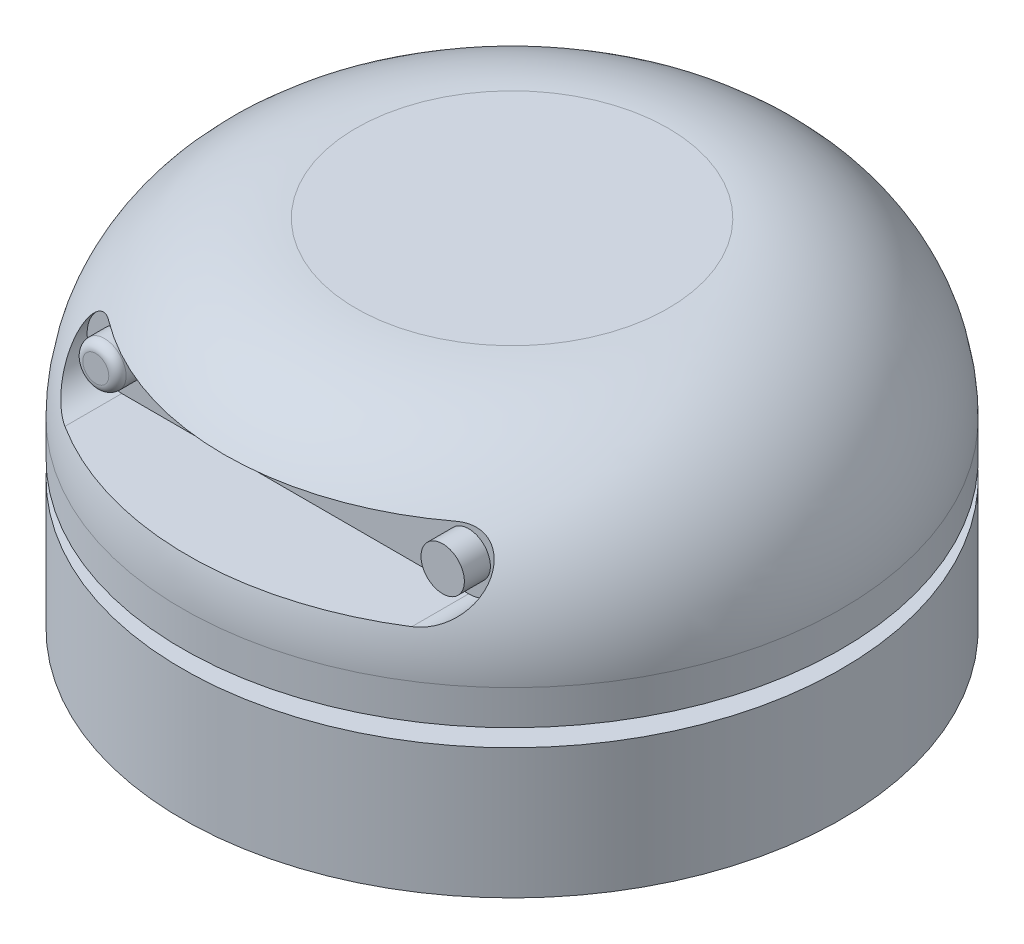
ISO-10303-21;
HEADER;
FILE_DESCRIPTION(('STEP AP214'),'2;1');
FILE_NAME('part.step','',(''),(''),'','','');
FILE_SCHEMA(('AUTOMOTIVE_DESIGN { 1 0 10303 214 1 1 1 1 }'));
ENDSEC;
DATA;
#1=APPLICATION_CONTEXT('core data for automotive mechanical design processes');
#2=APPLICATION_PROTOCOL_DEFINITION('international standard','automotive_design',2000,#1);
#3=PRODUCT_CONTEXT('',#1,'mechanical');
#4=PRODUCT('Part','Part','',(#3));
#5=PRODUCT_RELATED_PRODUCT_CATEGORY('part','',(#4));
#6=PRODUCT_DEFINITION_FORMATION('','',#4);
#7=PRODUCT_DEFINITION_CONTEXT('part definition',#1,'design');
#8=PRODUCT_DEFINITION('design','',#6,#7);
#9=PRODUCT_DEFINITION_SHAPE('','',#8);
#10=(LENGTH_UNIT() NAMED_UNIT(*) SI_UNIT(.MILLI.,.METRE.));
#11=(NAMED_UNIT(*) PLANE_ANGLE_UNIT() SI_UNIT($,.RADIAN.));
#12=(NAMED_UNIT(*) SI_UNIT($,.STERADIAN.) SOLID_ANGLE_UNIT());
#13=UNCERTAINTY_MEASURE_WITH_UNIT(LENGTH_MEASURE(1.E-05),#10,'distance_accuracy_value','');
#14=(GEOMETRIC_REPRESENTATION_CONTEXT(3) GLOBAL_UNCERTAINTY_ASSIGNED_CONTEXT((#13)) GLOBAL_UNIT_ASSIGNED_CONTEXT((#10,
#11,#12)) REPRESENTATION_CONTEXT('',''));
#15=CARTESIAN_POINT('',(0.,0.,0.));
#16=DIRECTION('',(0.,0.,1.));
#17=DIRECTION('',(1.,0.,0.));
#18=AXIS2_PLACEMENT_3D('',#15,#16,#17);
#19=CARTESIAN_POINT('',(0.,0.,0.));
#20=DIRECTION('',(0.,-1.,0.));
#21=DIRECTION('',(0.,0.,-1.));
#22=AXIS2_PLACEMENT_3D('',#19,#20,#21);
#23=PLANE('',#22);
#24=CARTESIAN_POINT('',(0.,0.,0.));
#25=DIRECTION('',(0.,-1.,0.));
#26=DIRECTION('',(0.,0.,-1.));
#27=AXIS2_PLACEMENT_3D('',#24,#25,#26);
#28=CIRCLE('',#27,38.);
#29=CARTESIAN_POINT('',(0.,0.,-38.));
#30=VERTEX_POINT('',#29);
#31=EDGE_CURVE('E128',#30,#30,#28,.T.);
#32=ORIENTED_EDGE('',*,*,#31,.T.);
#33=EDGE_LOOP('',(#32));
#34=FACE_BOUND('',#33,.T.);
#35=ADVANCED_FACE('F34',(#34),#23,.T.);
#36=CARTESIAN_POINT('',(0.,0.,0.));
#37=DIRECTION('',(0.,-1.,0.));
#38=DIRECTION('',(0.,0.,-1.));
#39=AXIS2_PLACEMENT_3D('',#36,#37,#38);
#40=CYLINDRICAL_SURFACE('',#39,38.);
#41=CARTESIAN_POINT('',(0.,15.,0.));
#42=DIRECTION('',(0.,-1.,0.));
#43=DIRECTION('',(0.,0.,-1.));
#44=AXIS2_PLACEMENT_3D('',#41,#42,#43);
#45=CIRCLE('',#44,38.);
#46=CARTESIAN_POINT('',(0.,15.,-38.));
#47=VERTEX_POINT('',#46);
#48=EDGE_CURVE('E125',#47,#47,#45,.T.);
#49=ORIENTED_EDGE('',*,*,#48,.T.);
#50=EDGE_LOOP('',(#49));
#51=FACE_BOUND('',#50,.T.);
#52=ORIENTED_EDGE('',*,*,#31,.F.);
#53=EDGE_LOOP('',(#52));
#54=FACE_BOUND('',#53,.T.);
#55=ADVANCED_FACE('F177',(#51,#54),#40,.T.);
#56=CARTESIAN_POINT('',(38.,15.,0.));
#57=DIRECTION('',(0.,1.,0.));
#58=DIRECTION('',(0.,0.,1.));
#59=AXIS2_PLACEMENT_3D('',#56,#57,#58);
#60=PLANE('',#59);
#61=CARTESIAN_POINT('',(0.,15.,0.));
#62=DIRECTION('',(0.,-1.,0.));
#63=DIRECTION('',(0.,0.,-1.));
#64=AXIS2_PLACEMENT_3D('',#61,#62,#63);
#65=CIRCLE('',#64,35.);
#66=CARTESIAN_POINT('',(0.,15.,-35.));
#67=VERTEX_POINT('',#66);
#68=EDGE_CURVE('E122',#67,#67,#65,.T.);
#69=ORIENTED_EDGE('',*,*,#68,.T.);
#70=EDGE_LOOP('',(#69));
#71=FACE_BOUND('',#70,.T.);
#72=ORIENTED_EDGE('',*,*,#48,.F.);
#73=EDGE_LOOP('',(#72));
#74=FACE_BOUND('',#73,.T.);
#75=ADVANCED_FACE('F182',(#71,#74),#60,.T.);
#76=CARTESIAN_POINT('',(0.,0.,0.));
#77=DIRECTION('',(0.,-1.,0.));
#78=DIRECTION('',(0.,0.,-1.));
#79=AXIS2_PLACEMENT_3D('',#76,#77,#78);
#80=CYLINDRICAL_SURFACE('',#79,35.);
#81=CARTESIAN_POINT('',(0.,17.,0.));
#82=DIRECTION('',(0.,-1.,0.));
#83=DIRECTION('',(0.,0.,-1.));
#84=AXIS2_PLACEMENT_3D('',#81,#82,#83);
#85=CIRCLE('',#84,35.);
#86=CARTESIAN_POINT('',(0.,17.,-35.));
#87=VERTEX_POINT('',#86);
#88=EDGE_CURVE('E119',#87,#87,#85,.T.);
#89=ORIENTED_EDGE('',*,*,#88,.T.);
#90=EDGE_LOOP('',(#89));
#91=FACE_BOUND('',#90,.T.);
#92=ORIENTED_EDGE('',*,*,#68,.F.);
#93=EDGE_LOOP('',(#92));
#94=FACE_BOUND('',#93,.T.);
#95=ADVANCED_FACE('F188',(#91,#94),#80,.T.);
#96=CARTESIAN_POINT('',(35.,17.,0.));
#97=DIRECTION('',(0.,-1.,0.));
#98=DIRECTION('',(0.,0.,-1.));
#99=AXIS2_PLACEMENT_3D('',#96,#97,#98);
#100=PLANE('',#99);
#101=CARTESIAN_POINT('',(0.,17.,0.));
#102=DIRECTION('',(0.,-1.,0.));
#103=DIRECTION('',(0.,0.,-1.));
#104=AXIS2_PLACEMENT_3D('',#101,#102,#103);
#105=CIRCLE('',#104,38.);
#106=CARTESIAN_POINT('',(0.,17.,-38.));
#107=VERTEX_POINT('',#106);
#108=EDGE_CURVE('E116',#107,#107,#105,.T.);
#109=ORIENTED_EDGE('',*,*,#108,.T.);
#110=EDGE_LOOP('',(#109));
#111=FACE_BOUND('',#110,.T.);
#112=ORIENTED_EDGE('',*,*,#88,.F.);
#113=EDGE_LOOP('',(#112));
#114=FACE_BOUND('',#113,.T.);
#115=ADVANCED_FACE('F192',(#111,#114),#100,.T.);
#116=CARTESIAN_POINT('',(0.,0.,0.));
#117=DIRECTION('',(0.,-1.,0.));
#118=DIRECTION('',(0.,0.,-1.));
#119=AXIS2_PLACEMENT_3D('',#116,#117,#118);
#120=CYLINDRICAL_SURFACE('',#119,38.);
#121=CARTESIAN_POINT('',(0.,20.9999999999999,0.));
#122=DIRECTION('',(0.,-1.,0.));
#123=DIRECTION('',(0.,0.,-1.));
#124=AXIS2_PLACEMENT_3D('',#121,#122,#123);
#125=CIRCLE('',#124,38.);
#126=CARTESIAN_POINT('',(0.,20.9999999999999,-38.));
#127=VERTEX_POINT('',#126);
#128=EDGE_CURVE('E113',#127,#127,#125,.T.);
#129=ORIENTED_EDGE('',*,*,#128,.T.);
#130=EDGE_LOOP('',(#129));
#131=FACE_BOUND('',#130,.T.);
#132=ORIENTED_EDGE('',*,*,#108,.F.);
#133=EDGE_LOOP('',(#132));
#134=FACE_BOUND('',#133,.T.);
#135=ADVANCED_FACE('F195',(#131,#134),#120,.T.);
#136=CARTESIAN_POINT('',(0.,21.,0.));
#137=DIRECTION('',(0.,-1.,0.));
#138=DIRECTION('',(0.,0.,-1.));
#139=AXIS2_PLACEMENT_3D('',#136,#137,#138);
#140=DEGENERATE_TOROIDAL_SURFACE('',#139,18.,20.,.T.);
#141=CARTESIAN_POINT('',(-19.9998000000001,33.999999995,26.4983137156405));
#142=CARTESIAN_POINT('',(-20.0860007837795,33.9999903899796,26.4332599205887));
#143=CARTESIAN_POINT('',(-20.1732952460292,33.9972206909735,26.3696851500208));
#144=CARTESIAN_POINT('',(-20.3501242373334,33.9856379562591,26.2459882158446));
#145=CARTESIAN_POINT('',(-20.4396624089846,33.9768143849396,26.1858722696616));
#146=CARTESIAN_POINT('',(-20.7128908151234,33.9402709853565,26.0107492221497));
#147=CARTESIAN_POINT('',(-20.8996398592403,33.9024588733698,25.9021605577095));
#148=CARTESIAN_POINT('',(-21.2384692692769,33.8066350640819,25.729013585884));
#149=CARTESIAN_POINT('',(-21.3898386920188,33.7543276184466,25.6599921964094));
#150=CARTESIAN_POINT('',(-21.6156732627474,33.6600883775282,25.5710953327386));
#151=CARTESIAN_POINT('',(-21.6906463365532,33.6261029128934,25.543929487848));
#152=CARTESIAN_POINT('',(-21.8396876449958,33.552806613435,25.4948551345381));
#153=CARTESIAN_POINT('',(-21.9137562594646,33.513498104218,25.472944341738));
#154=CARTESIAN_POINT('',(-22.061007654874,33.4292140754969,25.4345870195717));
#155=CARTESIAN_POINT('',(-22.1341763470015,33.3841904765187,25.4181917511177));
#156=CARTESIAN_POINT('',(-22.2781750553019,33.2889763207654,25.3914274523171));
#157=CARTESIAN_POINT('',(-22.3490061309142,33.238788148325,25.3810556556704));
#158=CARTESIAN_POINT('',(-22.4876952142505,33.1335207027957,25.3664593620049));
#159=CARTESIAN_POINT('',(-22.5555509225314,33.0784377430228,25.3622395409231));
#160=CARTESIAN_POINT('',(-22.6875453335789,32.9639079643178,25.3599255418519));
#161=CARTESIAN_POINT('',(-22.7516842898512,32.9044614436364,25.3618309455821));
#162=CARTESIAN_POINT('',(-22.9235728125817,32.7343252742577,25.3753839358381));
#163=CARTESIAN_POINT('',(-23.0268076900441,32.619473136582,25.3934115276649));
#164=CARTESIAN_POINT('',(-23.2176615313851,32.3811872386456,25.4462097210574));
#165=CARTESIAN_POINT('',(-23.3052767072154,32.2577514067522,25.4809843765284));
#166=CARTESIAN_POINT('',(-23.4889517846948,31.9660598467362,25.5777198171079));
#167=CARTESIAN_POINT('',(-23.5791632591904,31.7958043215255,25.6447721105444));
#168=CARTESIAN_POINT('',(-23.7321894081112,31.4513671777736,25.7974363471847));
#169=CARTESIAN_POINT('',(-23.7949546606187,31.2771790659638,25.8830813585151));
#170=CARTESIAN_POINT('',(-23.9111452167347,30.8721192118805,26.0982470534431));
#171=CARTESIAN_POINT('',(-23.9548842743305,30.6412478147932,26.2329760808266));
#172=CARTESIAN_POINT('',(-24.0022795542851,30.1855195054893,26.5184731205756));
#173=CARTESIAN_POINT('',(-24.0058777048991,29.960671776359,26.6692640515888));
#174=CARTESIAN_POINT('',(-23.9733087040721,29.4593630398323,27.0251732874454));
#175=CARTESIAN_POINT('',(-23.925739185721,29.1860534811138,27.2336913317449));
#176=CARTESIAN_POINT('',(-23.779400401254,28.6620115726425,27.6604746908621));
#177=CARTESIAN_POINT('',(-23.6806104195251,28.4112884059265,27.8787439167852));
#178=CARTESIAN_POINT('',(-23.4363227730806,27.935046415103,28.3223923124235));
#179=CARTESIAN_POINT('',(-23.2903308780445,27.7098299425679,28.5478228808337));
#180=CARTESIAN_POINT('',(-22.9569678221584,27.2930449848155,28.999530047474));
#181=CARTESIAN_POINT('',(-22.769565242662,27.1015022473532,29.225807159147));
#182=CARTESIAN_POINT('',(-22.3375509505397,26.7407308362499,29.6978940736991));
#183=CARTESIAN_POINT('',(-22.0890858976119,26.5756689072588,29.9433859105975));
#184=CARTESIAN_POINT('',(-21.554998463135,26.3024879062636,30.4247613037761));
#185=CARTESIAN_POINT('',(-21.2694695307137,26.1942289662803,30.6606671286119));
#186=CARTESIAN_POINT('',(-20.8147780735746,26.0806058824963,31.005719116712));
#187=CARTESIAN_POINT('',(-20.6561161752436,26.0508002103793,31.1209957946917));
#188=CARTESIAN_POINT('',(-20.3324055030931,26.0105081569874,31.3459210762577));
#189=CARTESIAN_POINT('',(-20.1673540956533,26.0000298304916,31.4555673148294));
#190=CARTESIAN_POINT('',(-19.9997999999999,26.000000005,31.5617648774726));
#191=B_SPLINE_CURVE_WITH_KNOTS('',3,(#141,#142,#143,#144,#145,#146,#147,#148,#149,#150,#151,
#152,#153,#154,#155,#156,#157,#158,#159,#160,#161,#162,#163,#164,#165,#166,#167,#168,#169,#170,
#171,#172,#173,#174,#175,#176,#177,#178,#179,#180,#181,#182,#183,#184,#185,#186,#187,#188,#189,
#190),.UNSPECIFIED.,.F.,.F.,(4,2,2,2,2,2,2,2,2,2,2,2,2,2,2,2,2,2,2,2,2,2,2,2,4),(0.,
0.323868319155006,0.648301703849512,1.30299883006232,1.82395499840501,2.083722472002,
2.34337681869454,2.60538169199046,2.86726614329806,3.12934954173316,3.39141504334696,
3.85558822289663,4.31987381980259,4.92855737352381,5.53833250411592,6.34654204345195,
7.15592066604027,8.19165383781354,9.22780622882341,10.2751795244185,11.3233502164732,
12.4766818824472,13.6271601721457,14.2212738805833,14.8156351333273),.UNSPECIFIED.);
#192=CARTESIAN_POINT('',(-20.,34.,26.4981627576054));
#193=VERTEX_POINT('',#192);
#194=CARTESIAN_POINT('',(-20.,26.,31.5616381437551));
#195=VERTEX_POINT('',#194);
#196=EDGE_CURVE('E80',#193,#195,#191,.T.);
#197=ORIENTED_EDGE('',*,*,#196,.F.);
#198=CARTESIAN_POINT('',(0.,34.,0.));
#199=DIRECTION('',(0.,1.,0.));
#200=DIRECTION('',(0.,0.,1.));
#201=AXIS2_PLACEMENT_3D('',#198,#199,#200);
#202=CIRCLE('',#201,33.1986841535707);
#203=CARTESIAN_POINT('',(20.,34.,26.4981627576054));
#204=VERTEX_POINT('',#203);
#205=EDGE_CURVE('E57',#204,#193,#202,.F.);
#206=ORIENTED_EDGE('',*,*,#205,.F.);
#207=CARTESIAN_POINT('',(19.9997999999999,26.000000005,31.5617648774726));
#208=CARTESIAN_POINT('',(20.1442309820804,26.0000155208609,31.4702300070399));
#209=CARTESIAN_POINT('',(20.2868228731015,26.0078073522598,31.3761110062333));
#210=CARTESIAN_POINT('',(20.5673222806469,26.0379210920222,31.1836044065626));
#211=CARTESIAN_POINT('',(20.7052344175304,26.0602282025552,31.0852212500979));
#212=CARTESIAN_POINT('',(21.109371590174,26.1470925464824,30.7858522827358));
#213=CARTESIAN_POINT('',(21.3676271646464,26.2316164066697,30.5796078982713));
#214=CARTESIAN_POINT('',(21.8447738940858,26.4416773851735,30.1686364756436));
#215=CARTESIAN_POINT('',(22.0649368705901,26.5651252965979,29.9642845902086));
#216=CARTESIAN_POINT('',(22.4761352468111,26.8486266049457,29.5511236516369));
#217=CARTESIAN_POINT('',(22.6671328341973,27.0087268603429,29.3423092058416));
#218=CARTESIAN_POINT('',(23.0423897255189,27.3874538672604,28.8916017691416));
#219=CARTESIAN_POINT('',(23.2211868577971,27.6112814858121,28.6495171024648));
#220=CARTESIAN_POINT('',(23.5287190498607,28.0946795968317,28.1681541953666));
#221=CARTESIAN_POINT('',(23.6573958000851,28.3542912477346,27.9288795359464));
#222=CARTESIAN_POINT('',(23.808498126204,28.7680957669013,27.5743238765768));
#223=CARTESIAN_POINT('',(23.8521243096263,28.9118593850333,27.4555518233496));
#224=CARTESIAN_POINT('',(23.923335296263,29.2060598745158,27.2213175006309));
#225=CARTESIAN_POINT('',(23.9509162374506,29.3564983431063,27.1058560343374));
#226=CARTESIAN_POINT('',(23.9887222870234,29.6626142002775,26.8798010578473));
#227=CARTESIAN_POINT('',(23.9989864990847,29.8182789735235,26.7691971306641));
#228=CARTESIAN_POINT('',(24.0008703263137,30.133858870536,26.5542529222121));
#229=CARTESIAN_POINT('',(23.9925041275645,30.2937706687966,26.4499079372201));
#230=CARTESIAN_POINT('',(23.9521944471316,30.645710731789,26.2313075379411));
#231=CARTESIAN_POINT('',(23.9162656119509,30.8383232760581,26.1186658850203));
#232=CARTESIAN_POINT('',(23.8133491422438,31.2239705810848,25.909658272811));
#233=CARTESIAN_POINT('',(23.7464127539771,31.4170041241403,25.8132658155808));
#234=CARTESIAN_POINT('',(23.5954923504686,31.760758070445,25.6598702260627));
#235=CARTESIAN_POINT('',(23.5175277101594,31.9122732676697,25.598846444703));
#236=CARTESIAN_POINT('',(23.3840615566077,32.1343886950284,25.5212121105208));
#237=CARTESIAN_POINT('',(23.3368030449465,32.2075887142,25.4976459255836));
#238=CARTESIAN_POINT('',(23.2368486613707,32.3516988676902,25.4556653696411));
#239=CARTESIAN_POINT('',(23.1841553273555,32.4226100506972,25.4372486087852));
#240=CARTESIAN_POINT('',(23.0730019085073,32.562165169889,25.405915637357));
#241=CARTESIAN_POINT('',(23.0144931487844,32.6307821853255,25.3930516889541));
#242=CARTESIAN_POINT('',(22.8925106728934,32.7643365208232,25.3735196372317));
#243=CARTESIAN_POINT('',(22.8290395248792,32.8292757146285,25.3668483517748));
#244=CARTESIAN_POINT('',(22.6976548205529,32.9548101786307,25.3600201288622));
#245=CARTESIAN_POINT('',(22.6297435023369,33.0154076055272,25.3598599344214));
#246=CARTESIAN_POINT('',(22.4901586747108,33.1316731401113,25.3661925492273));
#247=CARTESIAN_POINT('',(22.4184856171499,33.187341837675,25.3726845611575));
#248=CARTESIAN_POINT('',(22.2189672945405,33.3317261888407,25.3994624927275));
#249=CARTESIAN_POINT('',(22.088067998733,33.4151423537047,25.4263364178106));
#250=CARTESIAN_POINT('',(21.8215975716586,33.5644360858417,25.4984870536234));
#251=CARTESIAN_POINT('',(21.6860249239506,33.6303078985327,25.5437697902058));
#252=CARTESIAN_POINT('',(21.3762459074961,33.7605072032652,25.6649024830268));
#253=CARTESIAN_POINT('',(21.2017108180277,33.8193834898999,25.7457405789181));
#254=CARTESIAN_POINT('',(20.856109646633,33.9114234274341,25.9273316898139));
#255=CARTESIAN_POINT('',(20.6850524310167,33.9445278450169,26.0281299181255));
#256=CARTESIAN_POINT('',(20.4288986721962,33.9779398895502,26.1930434260175));
#257=CARTESIAN_POINT('',(20.3413625282932,33.9863529755056,26.2519974516029));
#258=CARTESIAN_POINT('',(20.1688073044174,33.9973634055222,26.3729530336387));
#259=CARTESIAN_POINT('',(20.0837764572417,33.9999946298219,26.4349346489573));
#260=CARTESIAN_POINT('',(19.9998000000001,33.999999995,26.4983137156405));
#261=B_SPLINE_CURVE_WITH_KNOTS('',3,(#207,#208,#209,#210,#211,#212,#213,#214,#215,#216,#217,
#218,#219,#220,#221,#222,#223,#224,#225,#226,#227,#228,#229,#230,#231,#232,#233,#234,#235,#236,
#237,#238,#239,#240,#241,#242,#243,#244,#245,#246,#247,#248,#249,#250,#251,#252,#253,#254,#255,
#256,#257,#258,#259,#260),.UNSPECIFIED.,.F.,.F.,(4,2,2,2,2,2,2,2,2,2,2,2,2,2,2,2,2,2,2,2,2,2,2,
2,2,2,4),(0.,0.512489316007837,1.0244569835252,2.04267618550456,3.01356218107368,
3.98569641436401,5.10597182847223,6.22754669475439,6.80142439608243,7.37544017043587,
7.94815799068143,8.52043986539835,9.19608061165852,9.87060868691201,10.4112742286536,
10.6817687265766,10.9521374786897,11.224998174993,11.4977185824248,11.7703025676731,
12.0428538855282,12.5129916026172,12.9832833364197,13.5834639184175,14.1850198986221,
14.5024422538438,14.8179995785116),.UNSPECIFIED.);
#262=CARTESIAN_POINT('',(20.,26.,31.5616381437551));
#263=VERTEX_POINT('',#262);
#264=EDGE_CURVE('E133',#263,#204,#261,.T.);
#265=ORIENTED_EDGE('',*,*,#264,.F.);
#266=CARTESIAN_POINT('',(0.,26.,0.));
#267=DIRECTION('',(0.,-1.,0.));
#268=DIRECTION('',(0.,0.,-1.));
#269=AXIS2_PLACEMENT_3D('',#266,#267,#268);
#270=CIRCLE('',#269,37.3649167310371);
#271=EDGE_CURVE('E131',#195,#263,#270,.F.);
#272=ORIENTED_EDGE('',*,*,#271,.F.);
#273=EDGE_LOOP('',(#197,#206,#265,#272));
#274=FACE_BOUND('',#273,.T.);
#275=CARTESIAN_POINT('',(0.,41.,0.));
#276=DIRECTION('',(0.,-1.,0.));
#277=DIRECTION('',(0.,0.,-1.));
#278=AXIS2_PLACEMENT_3D('',#275,#276,#277);
#279=CIRCLE('',#278,17.9999999999999);
#280=CARTESIAN_POINT('',(0.,41.,-17.9999999999999));
#281=VERTEX_POINT('',#280);
#282=EDGE_CURVE('E107',#281,#281,#279,.T.);
#283=ORIENTED_EDGE('',*,*,#282,.T.);
#284=EDGE_LOOP('',(#283));
#285=FACE_BOUND('',#284,.T.);
#286=ORIENTED_EDGE('',*,*,#128,.F.);
#287=EDGE_LOOP('',(#286));
#288=FACE_BOUND('',#287,.T.);
#289=ADVANCED_FACE('F141',(#274,#285,#288),#140,.T.);
#290=CARTESIAN_POINT('',(17.9999999999999,41.,0.));
#291=DIRECTION('',(0.,1.,0.));
#292=DIRECTION('',(0.,0.,1.));
#293=AXIS2_PLACEMENT_3D('',#290,#291,#292);
#294=PLANE('',#293);
#295=ORIENTED_EDGE('',*,*,#282,.F.);
#296=EDGE_LOOP('',(#295));
#297=FACE_BOUND('',#296,.T.);
#298=ADVANCED_FACE('F157',(#297),#294,.T.);
#299=CARTESIAN_POINT('',(-20.,30.,25.));
#300=DIRECTION('',(0.,0.,1.));
#301=DIRECTION('',(1.,0.,0.));
#302=AXIS2_PLACEMENT_3D('',#299,#300,#301);
#303=CYLINDRICAL_SURFACE('',#302,4.);
#304=ORIENTED_EDGE('',*,*,#196,.T.);
#305=DIRECTION('',(0.,0.,1.));
#306=VECTOR('',#305,1.);
#307=CARTESIAN_POINT('',(-20.,26.,25.));
#308=LINE('',#307,#306);
#309=CARTESIAN_POINT('',(-20.,26.,25.));
#310=VERTEX_POINT('',#309);
#311=EDGE_CURVE('E49',#310,#195,#308,.T.);
#312=ORIENTED_EDGE('',*,*,#311,.F.);
#313=CARTESIAN_POINT('',(-20.,30.,25.));
#314=DIRECTION('',(0.,0.,1.));
#315=DIRECTION('',(1.,0.,0.));
#316=AXIS2_PLACEMENT_3D('',#313,#314,#315);
#317=CIRCLE('',#316,4.);
#318=CARTESIAN_POINT('',(-20.,34.,25.));
#319=VERTEX_POINT('',#318);
#320=EDGE_CURVE('E77',#319,#310,#317,.T.);
#321=ORIENTED_EDGE('',*,*,#320,.F.);
#322=DIRECTION('',(0.,0.,1.));
#323=VECTOR('',#322,1.);
#324=CARTESIAN_POINT('',(-20.,34.,25.));
#325=LINE('',#324,#323);
#326=EDGE_CURVE('E105',#319,#193,#325,.T.);
#327=ORIENTED_EDGE('',*,*,#326,.T.);
#328=EDGE_LOOP('',(#304,#312,#321,#327));
#329=FACE_BOUND('',#328,.T.);
#330=ADVANCED_FACE('F75',(#329),#303,.F.);
#331=CARTESIAN_POINT('',(-20.,34.,25.));
#332=DIRECTION('',(0.,1.,0.));
#333=DIRECTION('',(0.,0.,1.));
#334=AXIS2_PLACEMENT_3D('',#331,#332,#333);
#335=PLANE('',#334);
#336=ORIENTED_EDGE('',*,*,#205,.T.);
#337=ORIENTED_EDGE('',*,*,#326,.F.);
#338=DIRECTION('',(-1.,0.,0.));
#339=VECTOR('',#338,1.);
#340=CARTESIAN_POINT('',(-20.,34.,25.));
#341=LINE('',#340,#339);
#342=CARTESIAN_POINT('',(20.,34.,25.));
#343=VERTEX_POINT('',#342);
#344=EDGE_CURVE('E83',#343,#319,#341,.T.);
#345=ORIENTED_EDGE('',*,*,#344,.F.);
#346=DIRECTION('',(0.,0.,1.));
#347=VECTOR('',#346,1.);
#348=CARTESIAN_POINT('',(20.,34.,25.));
#349=LINE('',#348,#347);
#350=EDGE_CURVE('E108',#343,#204,#349,.T.);
#351=ORIENTED_EDGE('',*,*,#350,.T.);
#352=EDGE_LOOP('',(#336,#337,#345,#351));
#353=FACE_BOUND('',#352,.T.);
#354=ADVANCED_FACE('F150',(#353),#335,.F.);
#355=CARTESIAN_POINT('',(20.,30.,25.));
#356=DIRECTION('',(0.,0.,1.));
#357=DIRECTION('',(1.,0.,0.));
#358=AXIS2_PLACEMENT_3D('',#355,#356,#357);
#359=CYLINDRICAL_SURFACE('',#358,4.);
#360=ORIENTED_EDGE('',*,*,#264,.T.);
#361=ORIENTED_EDGE('',*,*,#350,.F.);
#362=CARTESIAN_POINT('',(20.,30.,25.));
#363=DIRECTION('',(0.,0.,1.));
#364=DIRECTION('',(1.,0.,0.));
#365=AXIS2_PLACEMENT_3D('',#362,#363,#364);
#366=CIRCLE('',#365,4.);
#367=CARTESIAN_POINT('',(20.,26.,25.));
#368=VERTEX_POINT('',#367);
#369=EDGE_CURVE('E92',#368,#343,#366,.T.);
#370=ORIENTED_EDGE('',*,*,#369,.F.);
#371=DIRECTION('',(0.,0.,1.));
#372=VECTOR('',#371,1.);
#373=CARTESIAN_POINT('',(20.,26.,25.));
#374=LINE('',#373,#372);
#375=EDGE_CURVE('E82',#368,#263,#374,.T.);
#376=ORIENTED_EDGE('',*,*,#375,.T.);
#377=EDGE_LOOP('',(#360,#361,#370,#376));
#378=FACE_BOUND('',#377,.T.);
#379=ADVANCED_FACE('F145',(#378),#359,.F.);
#380=CARTESIAN_POINT('',(-20.,26.,25.));
#381=DIRECTION('',(0.,-1.,0.));
#382=DIRECTION('',(0.,0.,-1.));
#383=AXIS2_PLACEMENT_3D('',#380,#381,#382);
#384=PLANE('',#383);
#385=ORIENTED_EDGE('',*,*,#271,.T.);
#386=ORIENTED_EDGE('',*,*,#375,.F.);
#387=DIRECTION('',(1.,0.,0.));
#388=VECTOR('',#387,1.);
#389=CARTESIAN_POINT('',(-20.,26.,25.));
#390=LINE('',#389,#388);
#391=EDGE_CURVE('E86',#310,#368,#390,.T.);
#392=ORIENTED_EDGE('',*,*,#391,.F.);
#393=ORIENTED_EDGE('',*,*,#311,.T.);
#394=EDGE_LOOP('',(#385,#386,#392,#393));
#395=FACE_BOUND('',#394,.T.);
#396=ADVANCED_FACE('F87',(#395),#384,.F.);
#397=CARTESIAN_POINT('',(-20.,30.,25.));
#398=DIRECTION('',(0.,0.,1.));
#399=DIRECTION('',(1.,0.,0.));
#400=AXIS2_PLACEMENT_3D('',#397,#398,#399);
#401=PLANE('',#400);
#402=CARTESIAN_POINT('',(20.,30.,25.));
#403=DIRECTION('',(0.,0.,1.));
#404=DIRECTION('',(1.,0.,0.));
#405=AXIS2_PLACEMENT_3D('',#402,#403,#404);
#406=CIRCLE('',#405,2.5);
#407=CARTESIAN_POINT('',(22.5,30.,25.));
#408=VERTEX_POINT('',#407);
#409=EDGE_CURVE('E339',#408,#408,#406,.T.);
#410=ORIENTED_EDGE('',*,*,#409,.F.);
#411=EDGE_LOOP('',(#410));
#412=FACE_BOUND('',#411,.T.);
#413=CARTESIAN_POINT('',(-20.,30.,25.));
#414=DIRECTION('',(0.,0.,1.));
#415=DIRECTION('',(1.,0.,0.));
#416=AXIS2_PLACEMENT_3D('',#413,#414,#415);
#417=CIRCLE('',#416,2.5);
#418=CARTESIAN_POINT('',(-17.5,30.,25.));
#419=VERTEX_POINT('',#418);
#420=EDGE_CURVE('E96',#419,#419,#417,.T.);
#421=ORIENTED_EDGE('',*,*,#420,.F.);
#422=EDGE_LOOP('',(#421));
#423=FACE_BOUND('',#422,.T.);
#424=ORIENTED_EDGE('',*,*,#320,.T.);
#425=ORIENTED_EDGE('',*,*,#391,.T.);
#426=ORIENTED_EDGE('',*,*,#369,.T.);
#427=ORIENTED_EDGE('',*,*,#344,.T.);
#428=EDGE_LOOP('',(#424,#425,#426,#427));
#429=FACE_BOUND('',#428,.T.);
#430=ADVANCED_FACE('F94',(#412,#423,#429),#401,.T.);
#431=CARTESIAN_POINT('',(-20.,30.,28.));
#432=DIRECTION('',(0.,0.,-1.));
#433=DIRECTION('',(-1.,0.,0.));
#434=AXIS2_PLACEMENT_3D('',#431,#432,#433);
#435=CYLINDRICAL_SURFACE('',#434,2.5);
#436=CARTESIAN_POINT('',(-20.,30.,27.));
#437=DIRECTION('',(0.,0.,1.));
#438=DIRECTION('',(1.,0.,0.));
#439=AXIS2_PLACEMENT_3D('',#436,#437,#438);
#440=CIRCLE('',#439,2.5);
#441=CARTESIAN_POINT('',(-17.5,30.,27.));
#442=VERTEX_POINT('',#441);
#443=EDGE_CURVE('E11',#442,#442,#440,.F.);
#444=ORIENTED_EDGE('',*,*,#443,.T.);
#445=EDGE_LOOP('',(#444));
#446=FACE_BOUND('',#445,.T.);
#447=ORIENTED_EDGE('',*,*,#420,.T.);
#448=EDGE_LOOP('',(#447));
#449=FACE_BOUND('',#448,.T.);
#450=ADVANCED_FACE('F241',(#446,#449),#435,.T.);
#451=CARTESIAN_POINT('',(-20.,30.,28.));
#452=DIRECTION('',(0.,0.,1.));
#453=DIRECTION('',(1.,0.,0.));
#454=AXIS2_PLACEMENT_3D('',#451,#452,#453);
#455=PLANE('',#454);
#456=CARTESIAN_POINT('',(-20.,30.,28.));
#457=DIRECTION('',(0.,0.,1.));
#458=DIRECTION('',(1.,0.,0.));
#459=AXIS2_PLACEMENT_3D('',#456,#457,#458);
#460=CIRCLE('',#459,1.5);
#461=CARTESIAN_POINT('',(-18.5,30.,28.));
#462=VERTEX_POINT('',#461);
#463=EDGE_CURVE('E42',#462,#462,#460,.T.);
#464=ORIENTED_EDGE('',*,*,#463,.T.);
#465=EDGE_LOOP('',(#464));
#466=FACE_BOUND('',#465,.T.);
#467=ADVANCED_FACE('F164',(#466),#455,.T.);
#468=CARTESIAN_POINT('',(20.,30.,28.));
#469=DIRECTION('',(0.,0.,-1.));
#470=DIRECTION('',(-1.,0.,0.));
#471=AXIS2_PLACEMENT_3D('',#468,#469,#470);
#472=CYLINDRICAL_SURFACE('',#471,2.5);
#473=CARTESIAN_POINT('',(20.,30.,28.));
#474=DIRECTION('',(0.,0.,1.));
#475=DIRECTION('',(1.,0.,0.));
#476=AXIS2_PLACEMENT_3D('',#473,#474,#475);
#477=CIRCLE('',#476,2.5);
#478=CARTESIAN_POINT('',(22.5,30.,28.));
#479=VERTEX_POINT('',#478);
#480=EDGE_CURVE('E99',#479,#479,#477,.T.);
#481=ORIENTED_EDGE('',*,*,#480,.F.);
#482=EDGE_LOOP('',(#481));
#483=FACE_BOUND('',#482,.T.);
#484=ORIENTED_EDGE('',*,*,#409,.T.);
#485=EDGE_LOOP('',(#484));
#486=FACE_BOUND('',#485,.T.);
#487=ADVANCED_FACE('F172',(#483,#486),#472,.T.);
#488=CARTESIAN_POINT('',(20.,30.,28.));
#489=DIRECTION('',(0.,0.,1.));
#490=DIRECTION('',(1.,0.,0.));
#491=AXIS2_PLACEMENT_3D('',#488,#489,#490);
#492=PLANE('',#491);
#493=ORIENTED_EDGE('',*,*,#480,.T.);
#494=EDGE_LOOP('',(#493));
#495=FACE_BOUND('',#494,.T.);
#496=ADVANCED_FACE('F167',(#495),#492,.T.);
#497=CARTESIAN_POINT('',(-20.,30.,27.));
#498=DIRECTION('',(0.,0.,1.));
#499=DIRECTION('',(1.,0.,0.));
#500=AXIS2_PLACEMENT_3D('',#497,#498,#499);
#501=TOROIDAL_SURFACE('',#500,1.5,1.);
#502=ORIENTED_EDGE('',*,*,#443,.F.);
#503=EDGE_LOOP('',(#502));
#504=FACE_BOUND('',#503,.T.);
#505=ORIENTED_EDGE('',*,*,#463,.F.);
#506=EDGE_LOOP('',(#505));
#507=FACE_BOUND('',#506,.T.);
#508=ADVANCED_FACE('F36',(#504,#507),#501,.T.);
#509=CLOSED_SHELL('',(#35,#55,#75,#95,#115,#135,#289,#298,#330,#354,#379,#396,#430,#450,#467,
#487,#496,#508));
#510=MANIFOLD_SOLID_BREP('B2',#509);
#511=ADVANCED_BREP_SHAPE_REPRESENTATION('',(#18,#510),#14);
#512=SHAPE_DEFINITION_REPRESENTATION(#9,#511);
ENDSEC;
END-ISO-10303-21;
